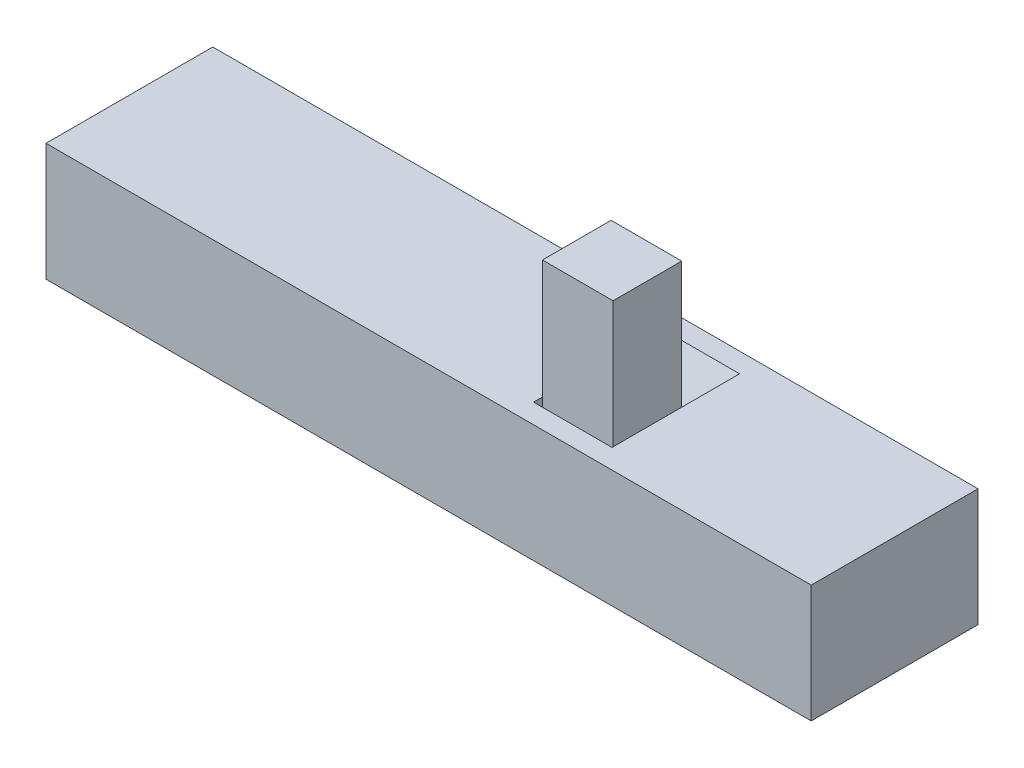
ISO-10303-21;
HEADER;
FILE_DESCRIPTION(('STEP AP214'),'2;1');
FILE_NAME('part.step','',(''),(''),'','','');
FILE_SCHEMA(('AUTOMOTIVE_DESIGN { 1 0 10303 214 1 1 1 1 }'));
ENDSEC;
DATA;
#1=APPLICATION_CONTEXT('core data for automotive mechanical design processes');
#2=APPLICATION_PROTOCOL_DEFINITION('international standard','automotive_design',2000,#1);
#3=PRODUCT_CONTEXT('',#1,'mechanical');
#4=PRODUCT('Part','Part','',(#3));
#5=PRODUCT_RELATED_PRODUCT_CATEGORY('part','',(#4));
#6=PRODUCT_DEFINITION_FORMATION('','',#4);
#7=PRODUCT_DEFINITION_CONTEXT('part definition',#1,'design');
#8=PRODUCT_DEFINITION('design','',#6,#7);
#9=PRODUCT_DEFINITION_SHAPE('','',#8);
#10=(LENGTH_UNIT() NAMED_UNIT(*) SI_UNIT(.MILLI.,.METRE.));
#11=(NAMED_UNIT(*) PLANE_ANGLE_UNIT() SI_UNIT($,.RADIAN.));
#12=(NAMED_UNIT(*) SI_UNIT($,.STERADIAN.) SOLID_ANGLE_UNIT());
#13=UNCERTAINTY_MEASURE_WITH_UNIT(LENGTH_MEASURE(1.E-05),#10,'distance_accuracy_value','');
#14=(GEOMETRIC_REPRESENTATION_CONTEXT(3) GLOBAL_UNCERTAINTY_ASSIGNED_CONTEXT((#13)) GLOBAL_UNIT_ASSIGNED_CONTEXT((#10,
#11,#12)) REPRESENTATION_CONTEXT('',''));
#15=CARTESIAN_POINT('',(0.,0.,0.));
#16=DIRECTION('',(0.,0.,1.));
#17=DIRECTION('',(1.,0.,0.));
#18=AXIS2_PLACEMENT_3D('',#15,#16,#17);
#19=CARTESIAN_POINT('',(24.05,0.,-1.25));
#20=DIRECTION('',(0.,0.,1.));
#21=DIRECTION('',(0.,-1.,0.));
#22=AXIS2_PLACEMENT_3D('',#19,#20,#21);
#23=PLANE('',#22);
#24=DIRECTION('',(0.,-1.,0.));
#25=VECTOR('',#24,1.);
#26=CARTESIAN_POINT('',(27.65,0.,-1.25));
#27=LINE('',#26,#25);
#28=CARTESIAN_POINT('',(27.65,12.25,-1.25));
#29=VERTEX_POINT('',#28);
#30=CARTESIAN_POINT('',(27.65,3.5,-1.25));
#31=VERTEX_POINT('',#30);
#32=EDGE_CURVE('E108',#29,#31,#27,.T.);
#33=ORIENTED_EDGE('',*,*,#32,.F.);
#34=DIRECTION('',(1.,0.,0.));
#35=VECTOR('',#34,1.);
#36=CARTESIAN_POINT('',(24.05,12.25,-1.25));
#37=LINE('',#36,#35);
#38=CARTESIAN_POINT('',(24.05,12.25,-1.25));
#39=VERTEX_POINT('',#38);
#40=EDGE_CURVE('E104',#39,#29,#37,.T.);
#41=ORIENTED_EDGE('',*,*,#40,.F.);
#42=DIRECTION('',(0.,-1.,0.));
#43=VECTOR('',#42,1.);
#44=CARTESIAN_POINT('',(24.05,0.,-1.25));
#45=LINE('',#44,#43);
#46=CARTESIAN_POINT('',(24.05,3.5,-1.25));
#47=VERTEX_POINT('',#46);
#48=EDGE_CURVE('E106',#39,#47,#45,.T.);
#49=ORIENTED_EDGE('',*,*,#48,.T.);
#50=DIRECTION('',(1.,0.,0.));
#51=VECTOR('',#50,1.);
#52=CARTESIAN_POINT('',(24.05,3.5,-1.25));
#53=LINE('',#52,#51);
#54=EDGE_CURVE('E134',#47,#31,#53,.T.);
#55=ORIENTED_EDGE('',*,*,#54,.T.);
#56=EDGE_LOOP('',(#33,#41,#49,#55));
#57=FACE_BOUND('',#56,.T.);
#58=ADVANCED_FACE('F59',(#57),#23,.T.);
#59=CARTESIAN_POINT('',(24.05,12.25,0.));
#60=DIRECTION('',(0.,1.,0.));
#61=DIRECTION('',(0.,0.,1.));
#62=AXIS2_PLACEMENT_3D('',#59,#60,#61);
#63=PLANE('',#62);
#64=DIRECTION('',(0.,0.,1.));
#65=VECTOR('',#64,1.);
#66=CARTESIAN_POINT('',(27.65,12.25,0.));
#67=LINE('',#66,#65);
#68=CARTESIAN_POINT('',(27.65,12.25,-4.75));
#69=VERTEX_POINT('',#68);
#70=EDGE_CURVE('E136',#69,#29,#67,.T.);
#71=ORIENTED_EDGE('',*,*,#70,.F.);
#72=DIRECTION('',(1.,0.,0.));
#73=VECTOR('',#72,1.);
#74=CARTESIAN_POINT('',(24.05,12.25,-4.75));
#75=LINE('',#74,#73);
#76=CARTESIAN_POINT('',(24.05,12.25,-4.75));
#77=VERTEX_POINT('',#76);
#78=EDGE_CURVE('E114',#77,#69,#75,.T.);
#79=ORIENTED_EDGE('',*,*,#78,.F.);
#80=DIRECTION('',(0.,0.,1.));
#81=VECTOR('',#80,1.);
#82=CARTESIAN_POINT('',(24.05,12.25,0.));
#83=LINE('',#82,#81);
#84=EDGE_CURVE('E119',#77,#39,#83,.T.);
#85=ORIENTED_EDGE('',*,*,#84,.T.);
#86=ORIENTED_EDGE('',*,*,#40,.T.);
#87=EDGE_LOOP('',(#71,#79,#85,#86));
#88=FACE_BOUND('',#87,.T.);
#89=ADVANCED_FACE('F126',(#88),#63,.T.);
#90=CARTESIAN_POINT('',(24.05,0.,-4.75));
#91=DIRECTION('',(0.,0.,-1.));
#92=DIRECTION('',(-1.,0.,0.));
#93=AXIS2_PLACEMENT_3D('',#90,#91,#92);
#94=PLANE('',#93);
#95=DIRECTION('',(0.,1.,0.));
#96=VECTOR('',#95,1.);
#97=CARTESIAN_POINT('',(27.65,0.,-4.75));
#98=LINE('',#97,#96);
#99=CARTESIAN_POINT('',(27.65,3.5,-4.75));
#100=VERTEX_POINT('',#99);
#101=EDGE_CURVE('E139',#100,#69,#98,.T.);
#102=ORIENTED_EDGE('',*,*,#101,.F.);
#103=DIRECTION('',(1.,0.,0.));
#104=VECTOR('',#103,1.);
#105=CARTESIAN_POINT('',(24.05,3.5,-4.75));
#106=LINE('',#105,#104);
#107=CARTESIAN_POINT('',(24.05,3.5,-4.75));
#108=VERTEX_POINT('',#107);
#109=EDGE_CURVE('E67',#100,#108,#106,.F.);
#110=ORIENTED_EDGE('',*,*,#109,.T.);
#111=DIRECTION('',(0.,1.,0.));
#112=VECTOR('',#111,1.);
#113=CARTESIAN_POINT('',(24.05,0.,-4.75));
#114=LINE('',#113,#112);
#115=EDGE_CURVE('E128',#108,#77,#114,.T.);
#116=ORIENTED_EDGE('',*,*,#115,.T.);
#117=ORIENTED_EDGE('',*,*,#78,.T.);
#118=EDGE_LOOP('',(#102,#110,#116,#117));
#119=FACE_BOUND('',#118,.T.);
#120=ADVANCED_FACE('F180',(#119),#94,.T.);
#121=CARTESIAN_POINT('',(24.05,3.5,-3.));
#122=DIRECTION('',(1.,0.,0.));
#123=DIRECTION('',(0.,0.,-1.));
#124=AXIS2_PLACEMENT_3D('',#121,#122,#123);
#125=CYLINDRICAL_SURFACE('',#124,1.75);
#126=CARTESIAN_POINT('',(27.65,3.5,-3.));
#127=DIRECTION('',(-1.,0.,0.));
#128=DIRECTION('',(0.,0.,1.));
#129=AXIS2_PLACEMENT_3D('',#126,#127,#128);
#130=CIRCLE('',#129,1.75);
#131=CARTESIAN_POINT('',(27.65,1.75,-3.));
#132=VERTEX_POINT('',#131);
#133=EDGE_CURVE('E123',#132,#31,#130,.T.);
#134=ORIENTED_EDGE('',*,*,#133,.T.);
#135=ORIENTED_EDGE('',*,*,#54,.F.);
#136=CARTESIAN_POINT('',(24.05,3.5,-3.));
#137=DIRECTION('',(-1.,0.,0.));
#138=DIRECTION('',(0.,0.,1.));
#139=AXIS2_PLACEMENT_3D('',#136,#137,#138);
#140=CIRCLE('',#139,1.75);
#141=CARTESIAN_POINT('',(24.05,1.75,-3.));
#142=VERTEX_POINT('',#141);
#143=EDGE_CURVE('E121',#142,#47,#140,.T.);
#144=ORIENTED_EDGE('',*,*,#143,.F.);
#145=DIRECTION('',(1.,0.,0.));
#146=VECTOR('',#145,1.);
#147=CARTESIAN_POINT('',(24.05,1.75,-3.));
#148=LINE('',#147,#146);
#149=EDGE_CURVE('E144',#142,#132,#148,.T.);
#150=ORIENTED_EDGE('',*,*,#149,.T.);
#151=EDGE_LOOP('',(#134,#135,#144,#150));
#152=FACE_BOUND('',#151,.T.);
#153=ADVANCED_FACE('F185',(#152),#125,.T.);
#154=CARTESIAN_POINT('',(24.05,0.,0.));
#155=DIRECTION('',(-1.,0.,0.));
#156=DIRECTION('',(0.,0.,1.));
#157=AXIS2_PLACEMENT_3D('',#154,#155,#156);
#158=PLANE('',#157);
#159=CARTESIAN_POINT('',(24.05,3.5,-3.));
#160=DIRECTION('',(-1.,0.,0.));
#161=DIRECTION('',(0.,0.,1.));
#162=AXIS2_PLACEMENT_3D('',#159,#160,#161);
#163=CIRCLE('',#162,1.3);
#164=CARTESIAN_POINT('',(24.05,3.5,-1.7));
#165=VERTEX_POINT('',#164);
#166=EDGE_CURVE('E113',#165,#165,#163,.T.);
#167=ORIENTED_EDGE('',*,*,#166,.F.);
#168=EDGE_LOOP('',(#167));
#169=FACE_BOUND('',#168,.T.);
#170=ORIENTED_EDGE('',*,*,#115,.F.);
#171=CARTESIAN_POINT('',(24.05,3.5,-3.));
#172=DIRECTION('',(-1.,0.,0.));
#173=DIRECTION('',(0.,0.,1.));
#174=AXIS2_PLACEMENT_3D('',#171,#172,#173);
#175=CIRCLE('',#174,1.75);
#176=EDGE_CURVE('E12',#108,#142,#175,.T.);
#177=ORIENTED_EDGE('',*,*,#176,.T.);
#178=ORIENTED_EDGE('',*,*,#143,.T.);
#179=ORIENTED_EDGE('',*,*,#48,.F.);
#180=ORIENTED_EDGE('',*,*,#84,.F.);
#181=EDGE_LOOP('',(#170,#177,#178,#179,#180));
#182=FACE_BOUND('',#181,.T.);
#183=ADVANCED_FACE('F118',(#169,#182),#158,.T.);
#184=CARTESIAN_POINT('',(27.65,0.,0.));
#185=DIRECTION('',(-1.,0.,0.));
#186=DIRECTION('',(0.,0.,1.));
#187=AXIS2_PLACEMENT_3D('',#184,#185,#186);
#188=PLANE('',#187);
#189=CARTESIAN_POINT('',(27.65,3.5,-3.));
#190=DIRECTION('',(-1.,0.,0.));
#191=DIRECTION('',(0.,0.,1.));
#192=AXIS2_PLACEMENT_3D('',#189,#190,#191);
#193=CIRCLE('',#192,1.3);
#194=CARTESIAN_POINT('',(27.65,3.5,-1.7));
#195=VERTEX_POINT('',#194);
#196=EDGE_CURVE('E137',#195,#195,#193,.T.);
#197=ORIENTED_EDGE('',*,*,#196,.T.);
#198=EDGE_LOOP('',(#197));
#199=FACE_BOUND('',#198,.T.);
#200=ORIENTED_EDGE('',*,*,#133,.F.);
#201=CARTESIAN_POINT('',(27.65,3.5,-3.));
#202=DIRECTION('',(-1.,0.,0.));
#203=DIRECTION('',(0.,0.,1.));
#204=AXIS2_PLACEMENT_3D('',#201,#202,#203);
#205=CIRCLE('',#204,1.75);
#206=EDGE_CURVE('E81',#132,#100,#205,.F.);
#207=ORIENTED_EDGE('',*,*,#206,.T.);
#208=ORIENTED_EDGE('',*,*,#101,.T.);
#209=ORIENTED_EDGE('',*,*,#70,.T.);
#210=ORIENTED_EDGE('',*,*,#32,.T.);
#211=EDGE_LOOP('',(#200,#207,#208,#209,#210));
#212=FACE_BOUND('',#211,.T.);
#213=ADVANCED_FACE('F189',(#199,#212),#188,.F.);
#214=CARTESIAN_POINT('',(31.45,3.5,-3.));
#215=DIRECTION('',(-1.,0.,0.));
#216=DIRECTION('',(0.,0.,1.));
#217=AXIS2_PLACEMENT_3D('',#214,#215,#216);
#218=PLANE('',#217);
#219=CARTESIAN_POINT('',(31.45,3.5,-3.));
#220=DIRECTION('',(-1.,0.,0.));
#221=DIRECTION('',(0.,0.,1.));
#222=AXIS2_PLACEMENT_3D('',#219,#220,#221);
#223=CIRCLE('',#222,1.3);
#224=CARTESIAN_POINT('',(31.45,3.5,-1.7));
#225=VERTEX_POINT('',#224);
#226=EDGE_CURVE('E150',#225,#225,#223,.T.);
#227=ORIENTED_EDGE('',*,*,#226,.F.);
#228=EDGE_LOOP('',(#227));
#229=FACE_BOUND('',#228,.T.);
#230=ADVANCED_FACE('F172',(#229),#218,.F.);
#231=CARTESIAN_POINT('',(31.45,3.5,-3.));
#232=DIRECTION('',(-1.,0.,0.));
#233=DIRECTION('',(0.,0.,1.));
#234=AXIS2_PLACEMENT_3D('',#231,#232,#233);
#235=CYLINDRICAL_SURFACE('',#234,1.3);
#236=ORIENTED_EDGE('',*,*,#226,.T.);
#237=EDGE_LOOP('',(#236));
#238=FACE_BOUND('',#237,.T.);
#239=ORIENTED_EDGE('',*,*,#196,.F.);
#240=EDGE_LOOP('',(#239));
#241=FACE_BOUND('',#240,.T.);
#242=ADVANCED_FACE('F165',(#238,#241),#235,.T.);
#243=ORIENTED_EDGE('',*,*,#166,.T.);
#244=EDGE_LOOP('',(#243));
#245=FACE_BOUND('',#244,.T.);
#246=CARTESIAN_POINT('',(20.25,3.5,-3.));
#247=DIRECTION('',(-1.,0.,0.));
#248=DIRECTION('',(0.,0.,1.));
#249=AXIS2_PLACEMENT_3D('',#246,#247,#248);
#250=CIRCLE('',#249,1.3);
#251=CARTESIAN_POINT('',(20.25,3.5,-1.7));
#252=VERTEX_POINT('',#251);
#253=EDGE_CURVE('E157',#252,#252,#250,.T.);
#254=ORIENTED_EDGE('',*,*,#253,.F.);
#255=EDGE_LOOP('',(#254));
#256=FACE_BOUND('',#255,.T.);
#257=ADVANCED_FACE('F163',(#245,#256),#235,.T.);
#258=CARTESIAN_POINT('',(20.25,3.5,-3.));
#259=DIRECTION('',(-1.,0.,0.));
#260=DIRECTION('',(0.,0.,1.));
#261=AXIS2_PLACEMENT_3D('',#258,#259,#260);
#262=PLANE('',#261);
#263=ORIENTED_EDGE('',*,*,#253,.T.);
#264=EDGE_LOOP('',(#263));
#265=FACE_BOUND('',#264,.T.);
#266=ADVANCED_FACE('F161',(#265),#262,.T.);
#267=CARTESIAN_POINT('',(24.05,3.5,-3.));
#268=DIRECTION('',(-1.,0.,0.));
#269=DIRECTION('',(0.,0.,1.));
#270=AXIS2_PLACEMENT_3D('',#267,#268,#269);
#271=CYLINDRICAL_SURFACE('',#270,1.75);
#272=ORIENTED_EDGE('',*,*,#176,.F.);
#273=ORIENTED_EDGE('',*,*,#109,.F.);
#274=ORIENTED_EDGE('',*,*,#206,.F.);
#275=ORIENTED_EDGE('',*,*,#149,.F.);
#276=EDGE_LOOP('',(#272,#273,#274,#275));
#277=FACE_BOUND('',#276,.T.);
#278=ADVANCED_FACE('F61',(#277),#271,.T.);
#279=CLOSED_SHELL('',(#58,#89,#120,#153,#183,#213,#230,#242,#257,#266,#278));
#280=MANIFOLD_SOLID_BREP('B2',#279);
#281=CARTESIAN_POINT('',(0.,6.,0.));
#282=DIRECTION('',(1.,0.,0.));
#283=DIRECTION('',(0.,0.,-1.));
#284=AXIS2_PLACEMENT_3D('',#281,#282,#283);
#285=PLANE('',#284);
#286=DIRECTION('',(0.,0.,1.));
#287=VECTOR('',#286,1.);
#288=CARTESIAN_POINT('',(0.,0.,0.));
#289=LINE('',#288,#287);
#290=CARTESIAN_POINT('',(0.,0.,-8.5));
#291=VERTEX_POINT('',#290);
#292=CARTESIAN_POINT('',(0.,0.,0.));
#293=VERTEX_POINT('',#292);
#294=EDGE_CURVE('E421',#291,#293,#289,.T.);
#295=ORIENTED_EDGE('',*,*,#294,.T.);
#296=DIRECTION('',(0.,-1.,0.));
#297=VECTOR('',#296,1.);
#298=CARTESIAN_POINT('',(0.,6.,0.));
#299=LINE('',#298,#297);
#300=CARTESIAN_POINT('',(0.,6.,0.));
#301=VERTEX_POINT('',#300);
#302=EDGE_CURVE('E57',#301,#293,#299,.T.);
#303=ORIENTED_EDGE('',*,*,#302,.F.);
#304=DIRECTION('',(0.,0.,1.));
#305=VECTOR('',#304,1.);
#306=CARTESIAN_POINT('',(0.,6.,0.));
#307=LINE('',#306,#305);
#308=CARTESIAN_POINT('',(0.,6.,-8.5));
#309=VERTEX_POINT('',#308);
#310=EDGE_CURVE('E424',#309,#301,#307,.T.);
#311=ORIENTED_EDGE('',*,*,#310,.F.);
#312=DIRECTION('',(0.,-1.,0.));
#313=VECTOR('',#312,1.);
#314=CARTESIAN_POINT('',(0.,6.,-8.5));
#315=LINE('',#314,#313);
#316=EDGE_CURVE('E434',#309,#291,#315,.T.);
#317=ORIENTED_EDGE('',*,*,#316,.T.);
#318=EDGE_LOOP('',(#295,#303,#311,#317));
#319=FACE_BOUND('',#318,.T.);
#320=ADVANCED_FACE('F286',(#319),#285,.F.);
#321=CARTESIAN_POINT('',(0.,6.,0.));
#322=DIRECTION('',(0.,0.,-1.));
#323=DIRECTION('',(-1.,0.,0.));
#324=AXIS2_PLACEMENT_3D('',#321,#322,#323);
#325=PLANE('',#324);
#326=DIRECTION('',(1.,0.,0.));
#327=VECTOR('',#326,1.);
#328=CARTESIAN_POINT('',(0.,0.,0.));
#329=LINE('',#328,#327);
#330=CARTESIAN_POINT('',(39.,0.,0.));
#331=VERTEX_POINT('',#330);
#332=EDGE_CURVE('E438',#293,#331,#329,.T.);
#333=ORIENTED_EDGE('',*,*,#332,.T.);
#334=DIRECTION('',(0.,-1.,0.));
#335=VECTOR('',#334,1.);
#336=CARTESIAN_POINT('',(39.,6.,0.));
#337=LINE('',#336,#335);
#338=CARTESIAN_POINT('',(39.,6.,0.));
#339=VERTEX_POINT('',#338);
#340=EDGE_CURVE('E295',#339,#331,#337,.T.);
#341=ORIENTED_EDGE('',*,*,#340,.F.);
#342=DIRECTION('',(1.,0.,0.));
#343=VECTOR('',#342,1.);
#344=CARTESIAN_POINT('',(0.,6.,0.));
#345=LINE('',#344,#343);
#346=EDGE_CURVE('E339',#301,#339,#345,.T.);
#347=ORIENTED_EDGE('',*,*,#346,.F.);
#348=ORIENTED_EDGE('',*,*,#302,.T.);
#349=EDGE_LOOP('',(#333,#341,#347,#348));
#350=FACE_BOUND('',#349,.T.);
#351=ADVANCED_FACE('F472',(#350),#325,.F.);
#352=CARTESIAN_POINT('',(39.,6.,0.));
#353=DIRECTION('',(-1.,0.,0.));
#354=DIRECTION('',(0.,0.,1.));
#355=AXIS2_PLACEMENT_3D('',#352,#353,#354);
#356=PLANE('',#355);
#357=DIRECTION('',(0.,0.,-1.));
#358=VECTOR('',#357,1.);
#359=CARTESIAN_POINT('',(39.,0.,0.));
#360=LINE('',#359,#358);
#361=CARTESIAN_POINT('',(39.,0.,-8.5));
#362=VERTEX_POINT('',#361);
#363=EDGE_CURVE('E441',#331,#362,#360,.T.);
#364=ORIENTED_EDGE('',*,*,#363,.T.);
#365=DIRECTION('',(0.,-1.,0.));
#366=VECTOR('',#365,1.);
#367=CARTESIAN_POINT('',(39.,6.,-8.5));
#368=LINE('',#367,#366);
#369=CARTESIAN_POINT('',(39.,6.,-8.5));
#370=VERTEX_POINT('',#369);
#371=EDGE_CURVE('E448',#370,#362,#368,.T.);
#372=ORIENTED_EDGE('',*,*,#371,.F.);
#373=DIRECTION('',(0.,0.,-1.));
#374=VECTOR('',#373,1.);
#375=CARTESIAN_POINT('',(39.,6.,0.));
#376=LINE('',#375,#374);
#377=EDGE_CURVE('E429',#339,#370,#376,.T.);
#378=ORIENTED_EDGE('',*,*,#377,.F.);
#379=ORIENTED_EDGE('',*,*,#340,.T.);
#380=EDGE_LOOP('',(#364,#372,#378,#379));
#381=FACE_BOUND('',#380,.T.);
#382=ADVANCED_FACE('F456',(#381),#356,.F.);
#383=CARTESIAN_POINT('',(0.,6.,-8.5));
#384=DIRECTION('',(0.,0.,1.));
#385=DIRECTION('',(1.,0.,0.));
#386=AXIS2_PLACEMENT_3D('',#383,#384,#385);
#387=PLANE('',#386);
#388=DIRECTION('',(-1.,0.,0.));
#389=VECTOR('',#388,1.);
#390=CARTESIAN_POINT('',(0.,0.,-8.5));
#391=LINE('',#390,#389);
#392=EDGE_CURVE('E332',#362,#291,#391,.T.);
#393=ORIENTED_EDGE('',*,*,#392,.T.);
#394=ORIENTED_EDGE('',*,*,#316,.F.);
#395=DIRECTION('',(-1.,0.,0.));
#396=VECTOR('',#395,1.);
#397=CARTESIAN_POINT('',(0.,6.,-8.5));
#398=LINE('',#397,#396);
#399=EDGE_CURVE('E311',#370,#309,#398,.T.);
#400=ORIENTED_EDGE('',*,*,#399,.F.);
#401=ORIENTED_EDGE('',*,*,#371,.T.);
#402=EDGE_LOOP('',(#393,#394,#400,#401));
#403=FACE_BOUND('',#402,.T.);
#404=ADVANCED_FACE('F464',(#403),#387,.F.);
#405=CARTESIAN_POINT('',(0.,6.,0.));
#406=DIRECTION('',(0.,-1.,0.));
#407=DIRECTION('',(0.,0.,-1.));
#408=AXIS2_PLACEMENT_3D('',#405,#406,#407);
#409=PLANE('',#408);
#410=DIRECTION('',(0.,0.,1.));
#411=VECTOR('',#410,1.);
#412=CARTESIAN_POINT('',(23.85,6.,-5.));
#413=LINE('',#412,#411);
#414=CARTESIAN_POINT('',(23.85,6.,-7.5));
#415=VERTEX_POINT('',#414);
#416=CARTESIAN_POINT('',(23.85,6.,-1.));
#417=VERTEX_POINT('',#416);
#418=EDGE_CURVE('E302',#415,#417,#413,.T.);
#419=ORIENTED_EDGE('',*,*,#418,.F.);
#420=DIRECTION('',(1.,0.,0.));
#421=VECTOR('',#420,1.);
#422=CARTESIAN_POINT('',(23.85,6.,-7.5));
#423=LINE('',#422,#421);
#424=CARTESIAN_POINT('',(27.85,6.,-7.5));
#425=VERTEX_POINT('',#424);
#426=EDGE_CURVE('E364',#415,#425,#423,.T.);
#427=ORIENTED_EDGE('',*,*,#426,.T.);
#428=DIRECTION('',(0.,0.,-1.));
#429=VECTOR('',#428,1.);
#430=CARTESIAN_POINT('',(27.85,6.,-5.));
#431=LINE('',#430,#429);
#432=CARTESIAN_POINT('',(27.85,6.,-1.));
#433=VERTEX_POINT('',#432);
#434=EDGE_CURVE('E402',#433,#425,#431,.T.);
#435=ORIENTED_EDGE('',*,*,#434,.F.);
#436=DIRECTION('',(1.,0.,0.));
#437=VECTOR('',#436,1.);
#438=CARTESIAN_POINT('',(23.85,6.,-1.));
#439=LINE('',#438,#437);
#440=EDGE_CURVE('E366',#417,#433,#439,.T.);
#441=ORIENTED_EDGE('',*,*,#440,.F.);
#442=EDGE_LOOP('',(#419,#427,#435,#441));
#443=FACE_BOUND('',#442,.T.);
#444=ORIENTED_EDGE('',*,*,#310,.T.);
#445=ORIENTED_EDGE('',*,*,#346,.T.);
#446=ORIENTED_EDGE('',*,*,#377,.T.);
#447=ORIENTED_EDGE('',*,*,#399,.T.);
#448=EDGE_LOOP('',(#444,#445,#446,#447));
#449=FACE_BOUND('',#448,.T.);
#450=ADVANCED_FACE('F362',(#443,#449),#409,.F.);
#451=CARTESIAN_POINT('',(0.,0.,0.));
#452=DIRECTION('',(0.,-1.,0.));
#453=DIRECTION('',(0.,0.,-1.));
#454=AXIS2_PLACEMENT_3D('',#451,#452,#453);
#455=PLANE('',#454);
#456=ORIENTED_EDGE('',*,*,#294,.F.);
#457=ORIENTED_EDGE('',*,*,#392,.F.);
#458=ORIENTED_EDGE('',*,*,#363,.F.);
#459=ORIENTED_EDGE('',*,*,#332,.F.);
#460=EDGE_LOOP('',(#456,#457,#458,#459));
#461=FACE_BOUND('',#460,.T.);
#462=ADVANCED_FACE('F460',(#461),#455,.T.);
#463=CARTESIAN_POINT('',(23.85,1.,-5.));
#464=DIRECTION('',(-1.,0.,0.));
#465=DIRECTION('',(0.,0.,1.));
#466=AXIS2_PLACEMENT_3D('',#463,#464,#465);
#467=PLANE('',#466);
#468=CARTESIAN_POINT('',(23.85,3.5,-3.));
#469=DIRECTION('',(-1.,0.,0.));
#470=DIRECTION('',(0.,0.,1.));
#471=AXIS2_PLACEMENT_3D('',#468,#469,#470);
#472=CIRCLE('',#471,1.5);
#473=CARTESIAN_POINT('',(23.85,3.5,-1.5));
#474=VERTEX_POINT('',#473);
#475=EDGE_CURVE('E368',#474,#474,#472,.F.);
#476=ORIENTED_EDGE('',*,*,#475,.F.);
#477=EDGE_LOOP('',(#476));
#478=FACE_BOUND('',#477,.T.);
#479=ORIENTED_EDGE('',*,*,#418,.T.);
#480=DIRECTION('',(0.,1.,0.));
#481=VECTOR('',#480,1.);
#482=CARTESIAN_POINT('',(23.85,1.,-1.));
#483=LINE('',#482,#481);
#484=CARTESIAN_POINT('',(23.85,1.,-1.));
#485=VERTEX_POINT('',#484);
#486=EDGE_CURVE('E412',#485,#417,#483,.T.);
#487=ORIENTED_EDGE('',*,*,#486,.F.);
#488=DIRECTION('',(0.,0.,1.));
#489=VECTOR('',#488,1.);
#490=CARTESIAN_POINT('',(23.85,1.,-5.));
#491=LINE('',#490,#489);
#492=CARTESIAN_POINT('',(23.85,1.,-5.));
#493=VERTEX_POINT('',#492);
#494=EDGE_CURVE('E382',#493,#485,#491,.T.);
#495=ORIENTED_EDGE('',*,*,#494,.F.);
#496=DIRECTION('',(0.,-0.894427190999916,0.447213595499958));
#497=VECTOR('',#496,1.);
#498=CARTESIAN_POINT('',(23.85,6.,-7.5));
#499=LINE('',#498,#497);
#500=EDGE_CURVE('E374',#415,#493,#499,.T.);
#501=ORIENTED_EDGE('',*,*,#500,.F.);
#502=EDGE_LOOP('',(#479,#487,#495,#501));
#503=FACE_BOUND('',#502,.T.);
#504=ADVANCED_FACE('F380',(#478,#503),#467,.F.);
#505=CARTESIAN_POINT('',(27.85,1.,-5.));
#506=DIRECTION('',(1.,0.,0.));
#507=DIRECTION('',(0.,0.,-1.));
#508=AXIS2_PLACEMENT_3D('',#505,#506,#507);
#509=PLANE('',#508);
#510=CARTESIAN_POINT('',(27.85,3.5,-3.));
#511=DIRECTION('',(1.,0.,0.));
#512=DIRECTION('',(0.,0.,-1.));
#513=AXIS2_PLACEMENT_3D('',#510,#511,#512);
#514=CIRCLE('',#513,1.5);
#515=CARTESIAN_POINT('',(27.85,3.5,-4.5));
#516=VERTEX_POINT('',#515);
#517=EDGE_CURVE('E289',#516,#516,#514,.F.);
#518=ORIENTED_EDGE('',*,*,#517,.F.);
#519=EDGE_LOOP('',(#518));
#520=FACE_BOUND('',#519,.T.);
#521=ORIENTED_EDGE('',*,*,#434,.T.);
#522=DIRECTION('',(0.,-0.894427190999916,0.447213595499958));
#523=VECTOR('',#522,1.);
#524=CARTESIAN_POINT('',(27.85,6.,-7.5));
#525=LINE('',#524,#523);
#526=CARTESIAN_POINT('',(27.85,1.,-5.));
#527=VERTEX_POINT('',#526);
#528=EDGE_CURVE('E376',#425,#527,#525,.T.);
#529=ORIENTED_EDGE('',*,*,#528,.T.);
#530=DIRECTION('',(0.,0.,-1.));
#531=VECTOR('',#530,1.);
#532=CARTESIAN_POINT('',(27.85,1.,-5.));
#533=LINE('',#532,#531);
#534=CARTESIAN_POINT('',(27.85,1.,-1.));
#535=VERTEX_POINT('',#534);
#536=EDGE_CURVE('E406',#535,#527,#533,.T.);
#537=ORIENTED_EDGE('',*,*,#536,.F.);
#538=DIRECTION('',(0.,1.,0.));
#539=VECTOR('',#538,1.);
#540=CARTESIAN_POINT('',(27.85,1.,-1.));
#541=LINE('',#540,#539);
#542=EDGE_CURVE('E418',#535,#433,#541,.T.);
#543=ORIENTED_EDGE('',*,*,#542,.T.);
#544=EDGE_LOOP('',(#521,#529,#537,#543));
#545=FACE_BOUND('',#544,.T.);
#546=ADVANCED_FACE('F496',(#520,#545),#509,.F.);
#547=CARTESIAN_POINT('',(23.85,1.,-1.));
#548=DIRECTION('',(0.,0.,1.));
#549=DIRECTION('',(1.,0.,0.));
#550=AXIS2_PLACEMENT_3D('',#547,#548,#549);
#551=PLANE('',#550);
#552=ORIENTED_EDGE('',*,*,#440,.T.);
#553=ORIENTED_EDGE('',*,*,#542,.F.);
#554=DIRECTION('',(1.,0.,0.));
#555=VECTOR('',#554,1.);
#556=CARTESIAN_POINT('',(23.85,1.,-1.));
#557=LINE('',#556,#555);
#558=EDGE_CURVE('E401',#485,#535,#557,.T.);
#559=ORIENTED_EDGE('',*,*,#558,.F.);
#560=ORIENTED_EDGE('',*,*,#486,.T.);
#561=EDGE_LOOP('',(#552,#553,#559,#560));
#562=FACE_BOUND('',#561,.T.);
#563=ADVANCED_FACE('F492',(#562),#551,.F.);
#564=CARTESIAN_POINT('',(0.,1.,0.));
#565=DIRECTION('',(0.,1.,0.));
#566=DIRECTION('',(0.,0.,1.));
#567=AXIS2_PLACEMENT_3D('',#564,#565,#566);
#568=PLANE('',#567);
#569=ORIENTED_EDGE('',*,*,#494,.T.);
#570=ORIENTED_EDGE('',*,*,#558,.T.);
#571=ORIENTED_EDGE('',*,*,#536,.T.);
#572=DIRECTION('',(-1.,0.,0.));
#573=VECTOR('',#572,1.);
#574=CARTESIAN_POINT('',(23.85,1.,-5.));
#575=LINE('',#574,#573);
#576=EDGE_CURVE('E410',#527,#493,#575,.T.);
#577=ORIENTED_EDGE('',*,*,#576,.T.);
#578=EDGE_LOOP('',(#569,#570,#571,#577));
#579=FACE_BOUND('',#578,.T.);
#580=ADVANCED_FACE('F495',(#579),#568,.T.);
#581=CARTESIAN_POINT('',(31.85,0.,0.));
#582=DIRECTION('',(-1.,0.,0.));
#583=DIRECTION('',(0.,0.,1.));
#584=AXIS2_PLACEMENT_3D('',#581,#582,#583);
#585=PLANE('',#584);
#586=CARTESIAN_POINT('',(31.85,3.5,-3.));
#587=DIRECTION('',(-1.,0.,0.));
#588=DIRECTION('',(0.,0.,1.));
#589=AXIS2_PLACEMENT_3D('',#586,#587,#588);
#590=CIRCLE('',#589,1.5);
#591=CARTESIAN_POINT('',(31.85,3.5,-1.5));
#592=VERTEX_POINT('',#591);
#593=EDGE_CURVE('E378',#592,#592,#590,.T.);
#594=ORIENTED_EDGE('',*,*,#593,.T.);
#595=EDGE_LOOP('',(#594));
#596=FACE_BOUND('',#595,.T.);
#597=ADVANCED_FACE('F503',(#596),#585,.T.);
#598=CARTESIAN_POINT('',(19.85,3.5,-3.));
#599=DIRECTION('',(1.,0.,0.));
#600=DIRECTION('',(0.,0.,-1.));
#601=AXIS2_PLACEMENT_3D('',#598,#599,#600);
#602=CYLINDRICAL_SURFACE('',#601,1.5);
#603=ORIENTED_EDGE('',*,*,#593,.F.);
#604=EDGE_LOOP('',(#603));
#605=FACE_BOUND('',#604,.T.);
#606=ORIENTED_EDGE('',*,*,#517,.T.);
#607=EDGE_LOOP('',(#606));
#608=FACE_BOUND('',#607,.T.);
#609=ADVANCED_FACE('F506',(#605,#608),#602,.F.);
#610=CARTESIAN_POINT('',(19.85,3.5,-3.));
#611=DIRECTION('',(-1.,0.,0.));
#612=DIRECTION('',(0.,0.,1.));
#613=AXIS2_PLACEMENT_3D('',#610,#611,#612);
#614=CIRCLE('',#613,1.5);
#615=CARTESIAN_POINT('',(19.85,3.5,-1.5));
#616=VERTEX_POINT('',#615);
#617=EDGE_CURVE('E392',#616,#616,#614,.T.);
#618=ORIENTED_EDGE('',*,*,#617,.T.);
#619=EDGE_LOOP('',(#618));
#620=FACE_BOUND('',#619,.T.);
#621=ORIENTED_EDGE('',*,*,#475,.T.);
#622=EDGE_LOOP('',(#621));
#623=FACE_BOUND('',#622,.T.);
#624=ADVANCED_FACE('F515',(#620,#623),#602,.F.);
#625=CARTESIAN_POINT('',(19.85,0.,0.));
#626=DIRECTION('',(-1.,0.,0.));
#627=DIRECTION('',(0.,0.,1.));
#628=AXIS2_PLACEMENT_3D('',#625,#626,#627);
#629=PLANE('',#628);
#630=ORIENTED_EDGE('',*,*,#617,.F.);
#631=EDGE_LOOP('',(#630));
#632=FACE_BOUND('',#631,.T.);
#633=ADVANCED_FACE('F524',(#632),#629,.F.);
#634=CARTESIAN_POINT('',(23.85,6.,-7.5));
#635=DIRECTION('',(0.,0.447213595499958,0.894427190999916));
#636=DIRECTION('',(0.,-0.894427190999916,0.447213595499958));
#637=AXIS2_PLACEMENT_3D('',#634,#635,#636);
#638=PLANE('',#637);
#639=ORIENTED_EDGE('',*,*,#528,.F.);
#640=ORIENTED_EDGE('',*,*,#426,.F.);
#641=ORIENTED_EDGE('',*,*,#500,.T.);
#642=ORIENTED_EDGE('',*,*,#576,.F.);
#643=EDGE_LOOP('',(#639,#640,#641,#642));
#644=FACE_BOUND('',#643,.T.);
#645=ADVANCED_FACE('F372',(#644),#638,.T.);
#646=CLOSED_SHELL('',(#320,#351,#382,#404,#450,#462,#504,#546,#563,#580,#597,#609,#624,#633,#645));
#647=MANIFOLD_SOLID_BREP('B6',#646);
#648=ADVANCED_BREP_SHAPE_REPRESENTATION('',(#18,#280,#647),#14);
#649=SHAPE_DEFINITION_REPRESENTATION(#9,#648);
ENDSEC;
END-ISO-10303-21;
